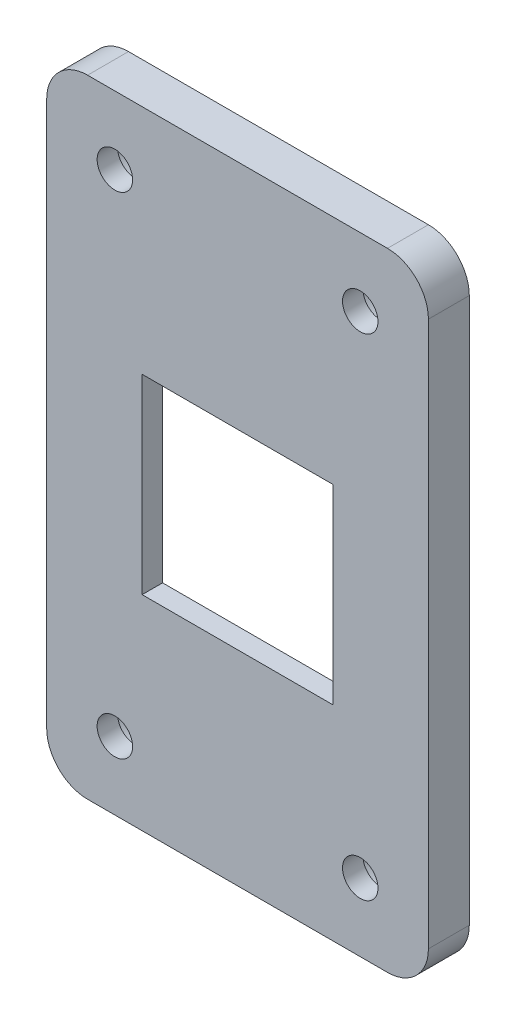
ISO-10303-21;
HEADER;
FILE_DESCRIPTION(('STEP AP214'),'2;1');
FILE_NAME('part.step','',(''),(''),'','','');
FILE_SCHEMA(('AUTOMOTIVE_DESIGN { 1 0 10303 214 1 1 1 1 }'));
ENDSEC;
DATA;
#1=APPLICATION_CONTEXT('core data for automotive mechanical design processes');
#2=APPLICATION_PROTOCOL_DEFINITION('international standard','automotive_design',2000,#1);
#3=PRODUCT_CONTEXT('',#1,'mechanical');
#4=PRODUCT('Part','Part','',(#3));
#5=PRODUCT_RELATED_PRODUCT_CATEGORY('part','',(#4));
#6=PRODUCT_DEFINITION_FORMATION('','',#4);
#7=PRODUCT_DEFINITION_CONTEXT('part definition',#1,'design');
#8=PRODUCT_DEFINITION('design','',#6,#7);
#9=PRODUCT_DEFINITION_SHAPE('','',#8);
#10=(LENGTH_UNIT() NAMED_UNIT(*) SI_UNIT(.MILLI.,.METRE.));
#11=(NAMED_UNIT(*) PLANE_ANGLE_UNIT() SI_UNIT($,.RADIAN.));
#12=(NAMED_UNIT(*) SI_UNIT($,.STERADIAN.) SOLID_ANGLE_UNIT());
#13=UNCERTAINTY_MEASURE_WITH_UNIT(LENGTH_MEASURE(1.E-05),#10,'distance_accuracy_value','');
#14=(GEOMETRIC_REPRESENTATION_CONTEXT(3) GLOBAL_UNCERTAINTY_ASSIGNED_CONTEXT((#13)) GLOBAL_UNIT_ASSIGNED_CONTEXT((#10,
#11,#12)) REPRESENTATION_CONTEXT('',''));
#15=CARTESIAN_POINT('',(0.,0.,0.));
#16=DIRECTION('',(0.,0.,1.));
#17=DIRECTION('',(1.,0.,0.));
#18=AXIS2_PLACEMENT_3D('',#15,#16,#17);
#19=CARTESIAN_POINT('',(-7.,0.,3.));
#20=DIRECTION('',(-1.,0.,0.));
#21=DIRECTION('',(0.,0.,1.));
#22=AXIS2_PLACEMENT_3D('',#19,#20,#21);
#23=PLANE('',#22);
#24=DIRECTION('',(0.,0.,-1.));
#25=VECTOR('',#24,1.);
#26=CARTESIAN_POINT('',(-7.,-8.,3.));
#27=LINE('',#26,#25);
#28=CARTESIAN_POINT('',(-7.,-8.,3.));
#29=VERTEX_POINT('',#28);
#30=CARTESIAN_POINT('',(-7.,-8.,1.5));
#31=VERTEX_POINT('',#30);
#32=EDGE_CURVE('E373',#29,#31,#27,.T.);
#33=ORIENTED_EDGE('',*,*,#32,.T.);
#34=DIRECTION('',(0.,1.,0.));
#35=VECTOR('',#34,1.);
#36=CARTESIAN_POINT('',(-7.,0.,1.5));
#37=LINE('',#36,#35);
#38=CARTESIAN_POINT('',(-7.,6.,1.5));
#39=VERTEX_POINT('',#38);
#40=EDGE_CURVE('E321',#31,#39,#37,.T.);
#41=ORIENTED_EDGE('',*,*,#40,.T.);
#42=DIRECTION('',(0.,0.,-1.));
#43=VECTOR('',#42,1.);
#44=CARTESIAN_POINT('',(-7.,6.,3.));
#45=LINE('',#44,#43);
#46=CARTESIAN_POINT('',(-7.,6.,3.));
#47=VERTEX_POINT('',#46);
#48=EDGE_CURVE('E398',#47,#39,#45,.T.);
#49=ORIENTED_EDGE('',*,*,#48,.F.);
#50=DIRECTION('',(0.,1.,0.));
#51=VECTOR('',#50,1.);
#52=CARTESIAN_POINT('',(-7.,0.,3.));
#53=LINE('',#52,#51);
#54=EDGE_CURVE('E358',#29,#47,#53,.T.);
#55=ORIENTED_EDGE('',*,*,#54,.F.);
#56=EDGE_LOOP('',(#33,#41,#49,#55));
#57=FACE_BOUND('',#56,.T.);
#58=ADVANCED_FACE('F46',(#57),#23,.F.);
#59=CARTESIAN_POINT('',(0.,6.,3.));
#60=DIRECTION('',(0.,1.,0.));
#61=DIRECTION('',(-1.,0.,0.));
#62=AXIS2_PLACEMENT_3D('',#59,#60,#61);
#63=PLANE('',#62);
#64=ORIENTED_EDGE('',*,*,#48,.T.);
#65=DIRECTION('',(1.,0.,0.));
#66=VECTOR('',#65,1.);
#67=CARTESIAN_POINT('',(0.,6.,1.5));
#68=LINE('',#67,#66);
#69=CARTESIAN_POINT('',(7.,6.,1.5));
#70=VERTEX_POINT('',#69);
#71=EDGE_CURVE('E316',#39,#70,#68,.T.);
#72=ORIENTED_EDGE('',*,*,#71,.T.);
#73=DIRECTION('',(0.,0.,-1.));
#74=VECTOR('',#73,1.);
#75=CARTESIAN_POINT('',(7.,6.,3.));
#76=LINE('',#75,#74);
#77=CARTESIAN_POINT('',(7.,6.,3.));
#78=VERTEX_POINT('',#77);
#79=EDGE_CURVE('E394',#78,#70,#76,.T.);
#80=ORIENTED_EDGE('',*,*,#79,.F.);
#81=DIRECTION('',(1.,0.,0.));
#82=VECTOR('',#81,1.);
#83=CARTESIAN_POINT('',(0.,6.,3.));
#84=LINE('',#83,#82);
#85=EDGE_CURVE('E362',#47,#78,#84,.T.);
#86=ORIENTED_EDGE('',*,*,#85,.F.);
#87=EDGE_LOOP('',(#64,#72,#80,#86));
#88=FACE_BOUND('',#87,.T.);
#89=ADVANCED_FACE('F510',(#88),#63,.F.);
#90=CARTESIAN_POINT('',(7.,0.,3.));
#91=DIRECTION('',(-1.,0.,0.));
#92=DIRECTION('',(0.,0.,1.));
#93=AXIS2_PLACEMENT_3D('',#90,#91,#92);
#94=PLANE('',#93);
#95=DIRECTION('',(0.,1.,0.));
#96=VECTOR('',#95,1.);
#97=CARTESIAN_POINT('',(7.,0.,1.5));
#98=LINE('',#97,#96);
#99=CARTESIAN_POINT('',(7.,-8.,1.5));
#100=VERTEX_POINT('',#99);
#101=EDGE_CURVE('E313',#100,#70,#98,.T.);
#102=ORIENTED_EDGE('',*,*,#101,.F.);
#103=DIRECTION('',(0.,0.,-1.));
#104=VECTOR('',#103,1.);
#105=CARTESIAN_POINT('',(7.,-8.,3.));
#106=LINE('',#105,#104);
#107=CARTESIAN_POINT('',(7.,-8.,3.));
#108=VERTEX_POINT('',#107);
#109=EDGE_CURVE('E390',#108,#100,#106,.T.);
#110=ORIENTED_EDGE('',*,*,#109,.F.);
#111=DIRECTION('',(0.,1.,0.));
#112=VECTOR('',#111,1.);
#113=CARTESIAN_POINT('',(7.,0.,3.));
#114=LINE('',#113,#112);
#115=EDGE_CURVE('E365',#108,#78,#114,.T.);
#116=ORIENTED_EDGE('',*,*,#115,.T.);
#117=ORIENTED_EDGE('',*,*,#79,.T.);
#118=EDGE_LOOP('',(#102,#110,#116,#117));
#119=FACE_BOUND('',#118,.T.);
#120=ADVANCED_FACE('F516',(#119),#94,.T.);
#121=CARTESIAN_POINT('',(-14.,0.,3.));
#122=DIRECTION('',(1.,0.,0.));
#123=DIRECTION('',(0.,0.,-1.));
#124=AXIS2_PLACEMENT_3D('',#121,#122,#123);
#125=PLANE('',#124);
#126=DIRECTION('',(0.,-1.,0.));
#127=VECTOR('',#126,1.);
#128=CARTESIAN_POINT('',(-14.,0.,0.));
#129=LINE('',#128,#127);
#130=CARTESIAN_POINT('',(-14.,20.,0.));
#131=VERTEX_POINT('',#130);
#132=CARTESIAN_POINT('',(-14.,-20.,0.));
#133=VERTEX_POINT('',#132);
#134=EDGE_CURVE('E341',#131,#133,#129,.T.);
#135=ORIENTED_EDGE('',*,*,#134,.T.);
#136=DIRECTION('',(0.,0.,-1.));
#137=VECTOR('',#136,1.);
#138=CARTESIAN_POINT('',(-14.,-20.,3.));
#139=LINE('',#138,#137);
#140=CARTESIAN_POINT('',(-14.,-20.,3.));
#141=VERTEX_POINT('',#140);
#142=EDGE_CURVE('E11',#133,#141,#139,.F.);
#143=ORIENTED_EDGE('',*,*,#142,.T.);
#144=DIRECTION('',(0.,-1.,0.));
#145=VECTOR('',#144,1.);
#146=CARTESIAN_POINT('',(-14.,0.,3.));
#147=LINE('',#146,#145);
#148=CARTESIAN_POINT('',(-14.,20.,3.));
#149=VERTEX_POINT('',#148);
#150=EDGE_CURVE('E342',#149,#141,#147,.T.);
#151=ORIENTED_EDGE('',*,*,#150,.F.);
#152=DIRECTION('',(0.,0.,-1.));
#153=VECTOR('',#152,1.);
#154=CARTESIAN_POINT('',(-14.,20.,0.));
#155=LINE('',#154,#153);
#156=EDGE_CURVE('E55',#149,#131,#155,.T.);
#157=ORIENTED_EDGE('',*,*,#156,.T.);
#158=EDGE_LOOP('',(#135,#143,#151,#157));
#159=FACE_BOUND('',#158,.T.);
#160=ADVANCED_FACE('F468',(#159),#125,.F.);
#161=CARTESIAN_POINT('',(0.,-23.,3.));
#162=DIRECTION('',(0.,1.,0.));
#163=DIRECTION('',(0.,0.,1.));
#164=AXIS2_PLACEMENT_3D('',#161,#162,#163);
#165=PLANE('',#164);
#166=DIRECTION('',(1.,0.,0.));
#167=VECTOR('',#166,1.);
#168=CARTESIAN_POINT('',(0.,-23.,0.));
#169=LINE('',#168,#167);
#170=CARTESIAN_POINT('',(-11.,-23.,0.));
#171=VERTEX_POINT('',#170);
#172=CARTESIAN_POINT('',(11.,-23.,0.));
#173=VERTEX_POINT('',#172);
#174=EDGE_CURVE('E377',#171,#173,#169,.T.);
#175=ORIENTED_EDGE('',*,*,#174,.T.);
#176=DIRECTION('',(0.,0.,-1.));
#177=VECTOR('',#176,1.);
#178=CARTESIAN_POINT('',(11.,-23.,3.));
#179=LINE('',#178,#177);
#180=CARTESIAN_POINT('',(11.,-23.,3.));
#181=VERTEX_POINT('',#180);
#182=EDGE_CURVE('E70',#173,#181,#179,.F.);
#183=ORIENTED_EDGE('',*,*,#182,.T.);
#184=DIRECTION('',(1.,0.,0.));
#185=VECTOR('',#184,1.);
#186=CARTESIAN_POINT('',(0.,-23.,3.));
#187=LINE('',#186,#185);
#188=CARTESIAN_POINT('',(-11.,-23.,3.));
#189=VERTEX_POINT('',#188);
#190=EDGE_CURVE('E346',#189,#181,#187,.T.);
#191=ORIENTED_EDGE('',*,*,#190,.F.);
#192=DIRECTION('',(0.,0.,-1.));
#193=VECTOR('',#192,1.);
#194=CARTESIAN_POINT('',(-11.,-23.,3.));
#195=LINE('',#194,#193);
#196=EDGE_CURVE('E457',#189,#171,#195,.T.);
#197=ORIENTED_EDGE('',*,*,#196,.T.);
#198=EDGE_LOOP('',(#175,#183,#191,#197));
#199=FACE_BOUND('',#198,.T.);
#200=ADVANCED_FACE('F480',(#199),#165,.F.);
#201=CARTESIAN_POINT('',(14.,0.,3.));
#202=DIRECTION('',(1.,0.,0.));
#203=DIRECTION('',(0.,0.,-1.));
#204=AXIS2_PLACEMENT_3D('',#201,#202,#203);
#205=PLANE('',#204);
#206=DIRECTION('',(0.,-1.,0.));
#207=VECTOR('',#206,1.);
#208=CARTESIAN_POINT('',(14.,0.,0.));
#209=LINE('',#208,#207);
#210=CARTESIAN_POINT('',(14.,20.,0.));
#211=VERTEX_POINT('',#210);
#212=CARTESIAN_POINT('',(14.,-20.,0.));
#213=VERTEX_POINT('',#212);
#214=EDGE_CURVE('E380',#211,#213,#209,.T.);
#215=ORIENTED_EDGE('',*,*,#214,.F.);
#216=DIRECTION('',(0.,0.,-1.));
#217=VECTOR('',#216,1.);
#218=CARTESIAN_POINT('',(14.,20.,3.));
#219=LINE('',#218,#217);
#220=CARTESIAN_POINT('',(14.,20.,3.));
#221=VERTEX_POINT('',#220);
#222=EDGE_CURVE('E442',#211,#221,#219,.F.);
#223=ORIENTED_EDGE('',*,*,#222,.T.);
#224=DIRECTION('',(0.,-1.,0.));
#225=VECTOR('',#224,1.);
#226=CARTESIAN_POINT('',(14.,0.,3.));
#227=LINE('',#226,#225);
#228=CARTESIAN_POINT('',(14.,-20.,3.));
#229=VERTEX_POINT('',#228);
#230=EDGE_CURVE('E350',#221,#229,#227,.T.);
#231=ORIENTED_EDGE('',*,*,#230,.T.);
#232=DIRECTION('',(0.,0.,-1.));
#233=VECTOR('',#232,1.);
#234=CARTESIAN_POINT('',(14.,-20.,0.));
#235=LINE('',#234,#233);
#236=EDGE_CURVE('E438',#229,#213,#235,.T.);
#237=ORIENTED_EDGE('',*,*,#236,.T.);
#238=EDGE_LOOP('',(#215,#223,#231,#237));
#239=FACE_BOUND('',#238,.T.);
#240=ADVANCED_FACE('F491',(#239),#205,.T.);
#241=CARTESIAN_POINT('',(0.,23.,3.));
#242=DIRECTION('',(0.,1.,0.));
#243=DIRECTION('',(0.,0.,1.));
#244=AXIS2_PLACEMENT_3D('',#241,#242,#243);
#245=PLANE('',#244);
#246=DIRECTION('',(1.,0.,0.));
#247=VECTOR('',#246,1.);
#248=CARTESIAN_POINT('',(0.,23.,3.));
#249=LINE('',#248,#247);
#250=CARTESIAN_POINT('',(-11.,23.,3.));
#251=VERTEX_POINT('',#250);
#252=CARTESIAN_POINT('',(11.,23.,3.));
#253=VERTEX_POINT('',#252);
#254=EDGE_CURVE('E354',#251,#253,#249,.T.);
#255=ORIENTED_EDGE('',*,*,#254,.T.);
#256=DIRECTION('',(0.,0.,-1.));
#257=VECTOR('',#256,1.);
#258=CARTESIAN_POINT('',(11.,23.,3.));
#259=LINE('',#258,#257);
#260=CARTESIAN_POINT('',(11.,23.,0.));
#261=VERTEX_POINT('',#260);
#262=EDGE_CURVE('E422',#253,#261,#259,.T.);
#263=ORIENTED_EDGE('',*,*,#262,.T.);
#264=DIRECTION('',(1.,0.,0.));
#265=VECTOR('',#264,1.);
#266=CARTESIAN_POINT('',(0.,23.,0.));
#267=LINE('',#266,#265);
#268=CARTESIAN_POINT('',(-11.,23.,0.));
#269=VERTEX_POINT('',#268);
#270=EDGE_CURVE('E347',#269,#261,#267,.T.);
#271=ORIENTED_EDGE('',*,*,#270,.F.);
#272=DIRECTION('',(0.,0.,-1.));
#273=VECTOR('',#272,1.);
#274=CARTESIAN_POINT('',(-11.,23.,3.));
#275=LINE('',#274,#273);
#276=EDGE_CURVE('E419',#269,#251,#275,.F.);
#277=ORIENTED_EDGE('',*,*,#276,.T.);
#278=EDGE_LOOP('',(#255,#263,#271,#277));
#279=FACE_BOUND('',#278,.T.);
#280=ADVANCED_FACE('F498',(#279),#245,.T.);
#281=CARTESIAN_POINT('',(0.,-8.,3.));
#282=DIRECTION('',(0.,1.,0.));
#283=DIRECTION('',(-1.,0.,0.));
#284=AXIS2_PLACEMENT_3D('',#281,#282,#283);
#285=PLANE('',#284);
#286=DIRECTION('',(1.,0.,0.));
#287=VECTOR('',#286,1.);
#288=CARTESIAN_POINT('',(0.,-8.,1.5));
#289=LINE('',#288,#287);
#290=EDGE_CURVE('E402',#31,#100,#289,.T.);
#291=ORIENTED_EDGE('',*,*,#290,.F.);
#292=ORIENTED_EDGE('',*,*,#32,.F.);
#293=DIRECTION('',(1.,0.,0.));
#294=VECTOR('',#293,1.);
#295=CARTESIAN_POINT('',(0.,-8.,3.));
#296=LINE('',#295,#294);
#297=EDGE_CURVE('E369',#29,#108,#296,.T.);
#298=ORIENTED_EDGE('',*,*,#297,.T.);
#299=ORIENTED_EDGE('',*,*,#109,.T.);
#300=EDGE_LOOP('',(#291,#292,#298,#299));
#301=FACE_BOUND('',#300,.T.);
#302=ADVANCED_FACE('F523',(#301),#285,.T.);
#303=CARTESIAN_POINT('',(0.,0.,3.));
#304=DIRECTION('',(0.,0.,1.));
#305=DIRECTION('',(1.,0.,0.));
#306=AXIS2_PLACEMENT_3D('',#303,#304,#305);
#307=PLANE('',#306);
#308=CARTESIAN_POINT('',(9.00000000000001,-18.,3.));
#309=DIRECTION('',(0.,0.,-1.));
#310=DIRECTION('',(-1.,0.,0.));
#311=AXIS2_PLACEMENT_3D('',#308,#309,#310);
#312=CIRCLE('',#311,1.3);
#313=CARTESIAN_POINT('',(7.70000000000001,-18.,3.));
#314=VERTEX_POINT('',#313);
#315=EDGE_CURVE('E325',#314,#314,#312,.T.);
#316=ORIENTED_EDGE('',*,*,#315,.T.);
#317=EDGE_LOOP('',(#316));
#318=FACE_BOUND('',#317,.T.);
#319=CARTESIAN_POINT('',(-9.,-18.,3.));
#320=DIRECTION('',(0.,0.,-1.));
#321=DIRECTION('',(-1.,0.,0.));
#322=AXIS2_PLACEMENT_3D('',#319,#320,#321);
#323=CIRCLE('',#322,1.3);
#324=CARTESIAN_POINT('',(-10.3,-18.,3.));
#325=VERTEX_POINT('',#324);
#326=EDGE_CURVE('E329',#325,#325,#323,.T.);
#327=ORIENTED_EDGE('',*,*,#326,.T.);
#328=EDGE_LOOP('',(#327));
#329=FACE_BOUND('',#328,.T.);
#330=CARTESIAN_POINT('',(9.,18.,3.));
#331=DIRECTION('',(0.,0.,-1.));
#332=DIRECTION('',(-1.,0.,0.));
#333=AXIS2_PLACEMENT_3D('',#330,#331,#332);
#334=CIRCLE('',#333,1.3);
#335=CARTESIAN_POINT('',(7.7,18.,3.));
#336=VERTEX_POINT('',#335);
#337=EDGE_CURVE('E333',#336,#336,#334,.T.);
#338=ORIENTED_EDGE('',*,*,#337,.T.);
#339=EDGE_LOOP('',(#338));
#340=FACE_BOUND('',#339,.T.);
#341=CARTESIAN_POINT('',(-9.,18.,3.));
#342=DIRECTION('',(0.,0.,-1.));
#343=DIRECTION('',(-1.,0.,0.));
#344=AXIS2_PLACEMENT_3D('',#341,#342,#343);
#345=CIRCLE('',#344,1.3);
#346=CARTESIAN_POINT('',(-10.3,18.,3.));
#347=VERTEX_POINT('',#346);
#348=EDGE_CURVE('E337',#347,#347,#345,.T.);
#349=ORIENTED_EDGE('',*,*,#348,.T.);
#350=EDGE_LOOP('',(#349));
#351=FACE_BOUND('',#350,.T.);
#352=ORIENTED_EDGE('',*,*,#230,.F.);
#353=CARTESIAN_POINT('',(11.,20.,3.));
#354=DIRECTION('',(0.,0.,1.));
#355=DIRECTION('',(1.,0.,0.));
#356=AXIS2_PLACEMENT_3D('',#353,#354,#355);
#357=CIRCLE('',#356,3.);
#358=EDGE_CURVE('E454',#221,#253,#357,.T.);
#359=ORIENTED_EDGE('',*,*,#358,.T.);
#360=ORIENTED_EDGE('',*,*,#254,.F.);
#361=CARTESIAN_POINT('',(-11.,20.,3.));
#362=DIRECTION('',(0.,0.,1.));
#363=DIRECTION('',(1.,0.,0.));
#364=AXIS2_PLACEMENT_3D('',#361,#362,#363);
#365=CIRCLE('',#364,3.);
#366=EDGE_CURVE('E445',#251,#149,#365,.T.);
#367=ORIENTED_EDGE('',*,*,#366,.T.);
#368=ORIENTED_EDGE('',*,*,#150,.T.);
#369=CARTESIAN_POINT('',(-11.,-20.,3.));
#370=DIRECTION('',(0.,0.,1.));
#371=DIRECTION('',(1.,0.,0.));
#372=AXIS2_PLACEMENT_3D('',#369,#370,#371);
#373=CIRCLE('',#372,3.);
#374=EDGE_CURVE('E448',#141,#189,#373,.T.);
#375=ORIENTED_EDGE('',*,*,#374,.T.);
#376=ORIENTED_EDGE('',*,*,#190,.T.);
#377=CARTESIAN_POINT('',(11.,-20.,3.));
#378=DIRECTION('',(0.,0.,1.));
#379=DIRECTION('',(1.,0.,0.));
#380=AXIS2_PLACEMENT_3D('',#377,#378,#379);
#381=CIRCLE('',#380,3.);
#382=EDGE_CURVE('E451',#181,#229,#381,.T.);
#383=ORIENTED_EDGE('',*,*,#382,.T.);
#384=EDGE_LOOP('',(#352,#359,#360,#367,#368,#375,#376,#383));
#385=FACE_BOUND('',#384,.T.);
#386=ORIENTED_EDGE('',*,*,#54,.T.);
#387=ORIENTED_EDGE('',*,*,#85,.T.);
#388=ORIENTED_EDGE('',*,*,#115,.F.);
#389=ORIENTED_EDGE('',*,*,#297,.F.);
#390=EDGE_LOOP('',(#386,#387,#388,#389));
#391=FACE_BOUND('',#390,.T.);
#392=ADVANCED_FACE('F484',(#318,#329,#340,#351,#385,#391),#307,.T.);
#393=CARTESIAN_POINT('',(0.,0.,0.));
#394=DIRECTION('',(0.,0.,1.));
#395=DIRECTION('',(1.,0.,0.));
#396=AXIS2_PLACEMENT_3D('',#393,#394,#395);
#397=PLANE('',#396);
#398=DIRECTION('',(0.,1.,0.));
#399=VECTOR('',#398,1.);
#400=CARTESIAN_POINT('',(-0.500000000000001,-15.,0.));
#401=LINE('',#400,#399);
#402=CARTESIAN_POINT('',(-0.500000000000001,-15.,0.));
#403=VERTEX_POINT('',#402);
#404=CARTESIAN_POINT('',(-0.5,-13.,0.));
#405=VERTEX_POINT('',#404);
#406=EDGE_CURVE('E221',#403,#405,#401,.T.);
#407=ORIENTED_EDGE('',*,*,#406,.F.);
#408=CARTESIAN_POINT('',(0.,-15.,0.));
#409=DIRECTION('',(0.,0.,-1.));
#410=DIRECTION('',(-1.,0.,0.));
#411=AXIS2_PLACEMENT_3D('',#408,#409,#410);
#412=CIRCLE('',#411,0.5);
#413=CARTESIAN_POINT('',(0.5,-15.,0.));
#414=VERTEX_POINT('',#413);
#415=EDGE_CURVE('E62',#414,#403,#412,.T.);
#416=ORIENTED_EDGE('',*,*,#415,.F.);
#417=DIRECTION('',(0.,-1.,0.));
#418=VECTOR('',#417,1.);
#419=CARTESIAN_POINT('',(0.5,-15.,0.));
#420=LINE('',#419,#418);
#421=CARTESIAN_POINT('',(0.5,-13.,0.));
#422=VERTEX_POINT('',#421);
#423=EDGE_CURVE('E208',#422,#414,#420,.T.);
#424=ORIENTED_EDGE('',*,*,#423,.F.);
#425=CARTESIAN_POINT('',(0.,-13.,0.));
#426=DIRECTION('',(0.,0.,-1.));
#427=DIRECTION('',(-1.,0.,0.));
#428=AXIS2_PLACEMENT_3D('',#425,#426,#427);
#429=CIRCLE('',#428,0.5);
#430=EDGE_CURVE('E212',#405,#422,#429,.T.);
#431=ORIENTED_EDGE('',*,*,#430,.F.);
#432=EDGE_LOOP('',(#407,#416,#424,#431));
#433=FACE_BOUND('',#432,.T.);
#434=CARTESIAN_POINT('',(-9.,-18.,0.));
#435=DIRECTION('',(0.,0.,1.));
#436=DIRECTION('',(1.,0.,0.));
#437=AXIS2_PLACEMENT_3D('',#434,#435,#436);
#438=CIRCLE('',#437,2.5);
#439=CARTESIAN_POINT('',(-6.5,-18.,0.));
#440=VERTEX_POINT('',#439);
#441=EDGE_CURVE('E289',#440,#440,#438,.T.);
#442=ORIENTED_EDGE('',*,*,#441,.T.);
#443=EDGE_LOOP('',(#442));
#444=FACE_BOUND('',#443,.T.);
#445=CARTESIAN_POINT('',(-9.,18.,0.));
#446=DIRECTION('',(0.,0.,1.));
#447=DIRECTION('',(1.,0.,0.));
#448=AXIS2_PLACEMENT_3D('',#445,#446,#447);
#449=CIRCLE('',#448,2.5);
#450=CARTESIAN_POINT('',(-6.5,18.,0.));
#451=VERTEX_POINT('',#450);
#452=EDGE_CURVE('E298',#451,#451,#449,.T.);
#453=ORIENTED_EDGE('',*,*,#452,.T.);
#454=EDGE_LOOP('',(#453));
#455=FACE_BOUND('',#454,.T.);
#456=CARTESIAN_POINT('',(9.,18.,0.));
#457=DIRECTION('',(0.,0.,1.));
#458=DIRECTION('',(1.,0.,0.));
#459=AXIS2_PLACEMENT_3D('',#456,#457,#458);
#460=CIRCLE('',#459,2.5);
#461=CARTESIAN_POINT('',(11.5,18.,0.));
#462=VERTEX_POINT('',#461);
#463=EDGE_CURVE('E236',#462,#462,#460,.T.);
#464=ORIENTED_EDGE('',*,*,#463,.T.);
#465=EDGE_LOOP('',(#464));
#466=FACE_BOUND('',#465,.T.);
#467=DIRECTION('',(1.,0.,0.));
#468=VECTOR('',#467,1.);
#469=CARTESIAN_POINT('',(-10.,-11.,0.));
#470=LINE('',#469,#468);
#471=CARTESIAN_POINT('',(-10.,-11.,0.));
#472=VERTEX_POINT('',#471);
#473=CARTESIAN_POINT('',(10.,-11.,0.));
#474=VERTEX_POINT('',#473);
#475=EDGE_CURVE('E245',#472,#474,#470,.T.);
#476=ORIENTED_EDGE('',*,*,#475,.T.);
#477=DIRECTION('',(0.,1.,0.));
#478=VECTOR('',#477,1.);
#479=CARTESIAN_POINT('',(10.,-11.,0.));
#480=LINE('',#479,#478);
#481=CARTESIAN_POINT('',(10.,9.,0.));
#482=VERTEX_POINT('',#481);
#483=EDGE_CURVE('E269',#474,#482,#480,.T.);
#484=ORIENTED_EDGE('',*,*,#483,.T.);
#485=DIRECTION('',(1.,0.,0.));
#486=VECTOR('',#485,1.);
#487=CARTESIAN_POINT('',(-10.,9.,0.));
#488=LINE('',#487,#486);
#489=CARTESIAN_POINT('',(-10.,9.,0.));
#490=VERTEX_POINT('',#489);
#491=EDGE_CURVE('E264',#490,#482,#488,.T.);
#492=ORIENTED_EDGE('',*,*,#491,.F.);
#493=DIRECTION('',(0.,1.,0.));
#494=VECTOR('',#493,1.);
#495=CARTESIAN_POINT('',(-10.,-11.,0.));
#496=LINE('',#495,#494);
#497=EDGE_CURVE('E260',#472,#490,#496,.T.);
#498=ORIENTED_EDGE('',*,*,#497,.F.);
#499=EDGE_LOOP('',(#476,#484,#492,#498));
#500=FACE_BOUND('',#499,.T.);
#501=CARTESIAN_POINT('',(9.00000000000001,-18.,0.));
#502=DIRECTION('',(0.,0.,1.));
#503=DIRECTION('',(1.,0.,0.));
#504=AXIS2_PLACEMENT_3D('',#501,#502,#503);
#505=CIRCLE('',#504,2.5);
#506=CARTESIAN_POINT('',(11.5,-18.,0.));
#507=VERTEX_POINT('',#506);
#508=EDGE_CURVE('E293',#507,#507,#505,.T.);
#509=ORIENTED_EDGE('',*,*,#508,.T.);
#510=EDGE_LOOP('',(#509));
#511=FACE_BOUND('',#510,.T.);
#512=ORIENTED_EDGE('',*,*,#270,.T.);
#513=CARTESIAN_POINT('',(11.,20.,0.));
#514=DIRECTION('',(0.,0.,1.));
#515=DIRECTION('',(1.,0.,0.));
#516=AXIS2_PLACEMENT_3D('',#513,#514,#515);
#517=CIRCLE('',#516,3.);
#518=EDGE_CURVE('E435',#261,#211,#517,.F.);
#519=ORIENTED_EDGE('',*,*,#518,.T.);
#520=ORIENTED_EDGE('',*,*,#214,.T.);
#521=CARTESIAN_POINT('',(11.,-20.,0.));
#522=DIRECTION('',(0.,0.,1.));
#523=DIRECTION('',(1.,0.,0.));
#524=AXIS2_PLACEMENT_3D('',#521,#522,#523);
#525=CIRCLE('',#524,3.);
#526=EDGE_CURVE('E432',#213,#173,#525,.F.);
#527=ORIENTED_EDGE('',*,*,#526,.T.);
#528=ORIENTED_EDGE('',*,*,#174,.F.);
#529=CARTESIAN_POINT('',(-11.,-20.,0.));
#530=DIRECTION('',(0.,0.,1.));
#531=DIRECTION('',(1.,0.,0.));
#532=AXIS2_PLACEMENT_3D('',#529,#530,#531);
#533=CIRCLE('',#532,3.);
#534=EDGE_CURVE('E429',#171,#133,#533,.F.);
#535=ORIENTED_EDGE('',*,*,#534,.T.);
#536=ORIENTED_EDGE('',*,*,#134,.F.);
#537=CARTESIAN_POINT('',(-11.,20.,0.));
#538=DIRECTION('',(0.,0.,1.));
#539=DIRECTION('',(1.,0.,0.));
#540=AXIS2_PLACEMENT_3D('',#537,#538,#539);
#541=CIRCLE('',#540,3.);
#542=EDGE_CURVE('E426',#131,#269,#541,.F.);
#543=ORIENTED_EDGE('',*,*,#542,.T.);
#544=EDGE_LOOP('',(#512,#519,#520,#527,#528,#535,#536,#543));
#545=FACE_BOUND('',#544,.T.);
#546=ADVANCED_FACE('F473',(#433,#444,#455,#466,#500,#511,#545),#397,.F.);
#547=CARTESIAN_POINT('',(-9.,18.,0.));
#548=DIRECTION('',(0.,0.,-1.));
#549=DIRECTION('',(-1.,0.,0.));
#550=AXIS2_PLACEMENT_3D('',#547,#548,#549);
#551=CYLINDRICAL_SURFACE('',#550,1.3);
#552=CARTESIAN_POINT('',(-9.,18.,1.5));
#553=DIRECTION('',(0.,0.,1.));
#554=DIRECTION('',(1.,0.,0.));
#555=AXIS2_PLACEMENT_3D('',#552,#553,#554);
#556=CIRCLE('',#555,1.3);
#557=CARTESIAN_POINT('',(-7.7,18.,1.5));
#558=VERTEX_POINT('',#557);
#559=EDGE_CURVE('E317',#558,#558,#556,.F.);
#560=ORIENTED_EDGE('',*,*,#559,.T.);
#561=EDGE_LOOP('',(#560));
#562=FACE_BOUND('',#561,.T.);
#563=ORIENTED_EDGE('',*,*,#348,.F.);
#564=EDGE_LOOP('',(#563));
#565=FACE_BOUND('',#564,.T.);
#566=ADVANCED_FACE('F656',(#562,#565),#551,.F.);
#567=CARTESIAN_POINT('',(9.,18.,0.));
#568=DIRECTION('',(0.,0.,-1.));
#569=DIRECTION('',(-1.,0.,0.));
#570=AXIS2_PLACEMENT_3D('',#567,#568,#569);
#571=CYLINDRICAL_SURFACE('',#570,1.3);
#572=CARTESIAN_POINT('',(9.,18.,1.5));
#573=DIRECTION('',(0.,0.,1.));
#574=DIRECTION('',(1.,0.,0.));
#575=AXIS2_PLACEMENT_3D('',#572,#573,#574);
#576=CIRCLE('',#575,1.3);
#577=CARTESIAN_POINT('',(10.3,18.,1.5));
#578=VERTEX_POINT('',#577);
#579=EDGE_CURVE('E410',#578,#578,#576,.F.);
#580=ORIENTED_EDGE('',*,*,#579,.T.);
#581=EDGE_LOOP('',(#580));
#582=FACE_BOUND('',#581,.T.);
#583=ORIENTED_EDGE('',*,*,#337,.F.);
#584=EDGE_LOOP('',(#583));
#585=FACE_BOUND('',#584,.T.);
#586=ADVANCED_FACE('F652',(#582,#585),#571,.F.);
#587=CARTESIAN_POINT('',(-9.,-18.,0.));
#588=DIRECTION('',(0.,0.,-1.));
#589=DIRECTION('',(-1.,0.,0.));
#590=AXIS2_PLACEMENT_3D('',#587,#588,#589);
#591=CYLINDRICAL_SURFACE('',#590,1.3);
#592=CARTESIAN_POINT('',(-9.,-18.,1.5));
#593=DIRECTION('',(0.,0.,1.));
#594=DIRECTION('',(1.,0.,0.));
#595=AXIS2_PLACEMENT_3D('',#592,#593,#594);
#596=CIRCLE('',#595,1.3);
#597=CARTESIAN_POINT('',(-7.7,-18.,1.5));
#598=VERTEX_POINT('',#597);
#599=EDGE_CURVE('E406',#598,#598,#596,.F.);
#600=ORIENTED_EDGE('',*,*,#599,.T.);
#601=EDGE_LOOP('',(#600));
#602=FACE_BOUND('',#601,.T.);
#603=ORIENTED_EDGE('',*,*,#326,.F.);
#604=EDGE_LOOP('',(#603));
#605=FACE_BOUND('',#604,.T.);
#606=ADVANCED_FACE('F648',(#602,#605),#591,.F.);
#607=CARTESIAN_POINT('',(9.00000000000001,-18.,0.));
#608=DIRECTION('',(0.,0.,-1.));
#609=DIRECTION('',(-1.,0.,0.));
#610=AXIS2_PLACEMENT_3D('',#607,#608,#609);
#611=CYLINDRICAL_SURFACE('',#610,1.3);
#612=CARTESIAN_POINT('',(9.00000000000001,-18.,1.5));
#613=DIRECTION('',(0.,0.,1.));
#614=DIRECTION('',(1.,0.,0.));
#615=AXIS2_PLACEMENT_3D('',#612,#613,#614);
#616=CIRCLE('',#615,1.3);
#617=CARTESIAN_POINT('',(10.3,-18.,1.5));
#618=VERTEX_POINT('',#617);
#619=EDGE_CURVE('E309',#618,#618,#616,.F.);
#620=ORIENTED_EDGE('',*,*,#619,.T.);
#621=EDGE_LOOP('',(#620));
#622=FACE_BOUND('',#621,.T.);
#623=ORIENTED_EDGE('',*,*,#315,.F.);
#624=EDGE_LOOP('',(#623));
#625=FACE_BOUND('',#624,.T.);
#626=ADVANCED_FACE('F641',(#622,#625),#611,.F.);
#627=CARTESIAN_POINT('',(0.,0.,1.5));
#628=DIRECTION('',(0.,0.,1.));
#629=DIRECTION('',(1.,0.,0.));
#630=AXIS2_PLACEMENT_3D('',#627,#628,#629);
#631=PLANE('',#630);
#632=CARTESIAN_POINT('',(9.00000000000001,-18.,1.5));
#633=DIRECTION('',(0.,0.,1.));
#634=DIRECTION('',(1.,0.,0.));
#635=AXIS2_PLACEMENT_3D('',#632,#633,#634);
#636=CIRCLE('',#635,2.5);
#637=CARTESIAN_POINT('',(11.5,-18.,1.5));
#638=VERTEX_POINT('',#637);
#639=EDGE_CURVE('E305',#638,#638,#636,.T.);
#640=ORIENTED_EDGE('',*,*,#639,.F.);
#641=EDGE_LOOP('',(#640));
#642=FACE_BOUND('',#641,.T.);
#643=ORIENTED_EDGE('',*,*,#619,.F.);
#644=EDGE_LOOP('',(#643));
#645=FACE_BOUND('',#644,.T.);
#646=ADVANCED_FACE('F638',(#642,#645),#631,.F.);
#647=CARTESIAN_POINT('',(9.00000000000001,-18.,1.5));
#648=DIRECTION('',(0.,0.,-1.));
#649=DIRECTION('',(-1.,0.,0.));
#650=AXIS2_PLACEMENT_3D('',#647,#648,#649);
#651=CYLINDRICAL_SURFACE('',#650,2.5);
#652=ORIENTED_EDGE('',*,*,#639,.T.);
#653=EDGE_LOOP('',(#652));
#654=FACE_BOUND('',#653,.T.);
#655=ORIENTED_EDGE('',*,*,#508,.F.);
#656=EDGE_LOOP('',(#655));
#657=FACE_BOUND('',#656,.T.);
#658=ADVANCED_FACE('F630',(#654,#657),#651,.F.);
#659=CARTESIAN_POINT('',(0.,0.,1.5));
#660=DIRECTION('',(0.,0.,1.));
#661=DIRECTION('',(1.,0.,0.));
#662=AXIS2_PLACEMENT_3D('',#659,#660,#661);
#663=PLANE('',#662);
#664=CARTESIAN_POINT('',(-9.,-18.,1.5));
#665=DIRECTION('',(0.,0.,1.));
#666=DIRECTION('',(1.,0.,0.));
#667=AXIS2_PLACEMENT_3D('',#664,#665,#666);
#668=CIRCLE('',#667,2.5);
#669=CARTESIAN_POINT('',(-6.5,-18.,1.5));
#670=VERTEX_POINT('',#669);
#671=EDGE_CURVE('E294',#670,#670,#668,.T.);
#672=ORIENTED_EDGE('',*,*,#671,.F.);
#673=EDGE_LOOP('',(#672));
#674=FACE_BOUND('',#673,.T.);
#675=ORIENTED_EDGE('',*,*,#599,.F.);
#676=EDGE_LOOP('',(#675));
#677=FACE_BOUND('',#676,.T.);
#678=ADVANCED_FACE('F626',(#674,#677),#663,.F.);
#679=CARTESIAN_POINT('',(-9.,-18.,1.5));
#680=DIRECTION('',(0.,0.,-1.));
#681=DIRECTION('',(-1.,0.,0.));
#682=AXIS2_PLACEMENT_3D('',#679,#680,#681);
#683=CYLINDRICAL_SURFACE('',#682,2.5);
#684=ORIENTED_EDGE('',*,*,#671,.T.);
#685=EDGE_LOOP('',(#684));
#686=FACE_BOUND('',#685,.T.);
#687=ORIENTED_EDGE('',*,*,#441,.F.);
#688=EDGE_LOOP('',(#687));
#689=FACE_BOUND('',#688,.T.);
#690=ADVANCED_FACE('F602',(#686,#689),#683,.F.);
#691=CARTESIAN_POINT('',(0.,0.,1.5));
#692=DIRECTION('',(0.,0.,1.));
#693=DIRECTION('',(1.,0.,0.));
#694=AXIS2_PLACEMENT_3D('',#691,#692,#693);
#695=PLANE('',#694);
#696=CARTESIAN_POINT('',(9.,18.,1.5));
#697=DIRECTION('',(0.,0.,1.));
#698=DIRECTION('',(1.,0.,0.));
#699=AXIS2_PLACEMENT_3D('',#696,#697,#698);
#700=CIRCLE('',#699,2.5);
#701=CARTESIAN_POINT('',(11.5,18.,1.5));
#702=VERTEX_POINT('',#701);
#703=EDGE_CURVE('E241',#702,#702,#700,.T.);
#704=ORIENTED_EDGE('',*,*,#703,.F.);
#705=EDGE_LOOP('',(#704));
#706=FACE_BOUND('',#705,.T.);
#707=ORIENTED_EDGE('',*,*,#579,.F.);
#708=EDGE_LOOP('',(#707));
#709=FACE_BOUND('',#708,.T.);
#710=ADVANCED_FACE('F598',(#706,#709),#695,.F.);
#711=CARTESIAN_POINT('',(9.,18.,1.5));
#712=DIRECTION('',(0.,0.,-1.));
#713=DIRECTION('',(-1.,0.,0.));
#714=AXIS2_PLACEMENT_3D('',#711,#712,#713);
#715=CYLINDRICAL_SURFACE('',#714,2.5);
#716=ORIENTED_EDGE('',*,*,#703,.T.);
#717=EDGE_LOOP('',(#716));
#718=FACE_BOUND('',#717,.T.);
#719=ORIENTED_EDGE('',*,*,#463,.F.);
#720=EDGE_LOOP('',(#719));
#721=FACE_BOUND('',#720,.T.);
#722=ADVANCED_FACE('F594',(#718,#721),#715,.F.);
#723=CARTESIAN_POINT('',(0.,0.,1.5));
#724=DIRECTION('',(0.,0.,1.));
#725=DIRECTION('',(1.,0.,0.));
#726=AXIS2_PLACEMENT_3D('',#723,#724,#725);
#727=PLANE('',#726);
#728=CARTESIAN_POINT('',(-9.,18.,1.5));
#729=DIRECTION('',(0.,0.,1.));
#730=DIRECTION('',(1.,0.,0.));
#731=AXIS2_PLACEMENT_3D('',#728,#729,#730);
#732=CIRCLE('',#731,2.5);
#733=CARTESIAN_POINT('',(-6.5,18.,1.5));
#734=VERTEX_POINT('',#733);
#735=EDGE_CURVE('E240',#734,#734,#732,.T.);
#736=ORIENTED_EDGE('',*,*,#735,.F.);
#737=EDGE_LOOP('',(#736));
#738=FACE_BOUND('',#737,.T.);
#739=ORIENTED_EDGE('',*,*,#559,.F.);
#740=EDGE_LOOP('',(#739));
#741=FACE_BOUND('',#740,.T.);
#742=ADVANCED_FACE('F597',(#738,#741),#727,.F.);
#743=CARTESIAN_POINT('',(-9.,18.,1.5));
#744=DIRECTION('',(0.,0.,-1.));
#745=DIRECTION('',(-1.,0.,0.));
#746=AXIS2_PLACEMENT_3D('',#743,#744,#745);
#747=CYLINDRICAL_SURFACE('',#746,2.5);
#748=ORIENTED_EDGE('',*,*,#735,.T.);
#749=EDGE_LOOP('',(#748));
#750=FACE_BOUND('',#749,.T.);
#751=ORIENTED_EDGE('',*,*,#452,.F.);
#752=EDGE_LOOP('',(#751));
#753=FACE_BOUND('',#752,.T.);
#754=ADVANCED_FACE('F622',(#750,#753),#747,.F.);
#755=CARTESIAN_POINT('',(0.,0.,1.5));
#756=DIRECTION('',(0.,0.,1.));
#757=DIRECTION('',(1.,0.,0.));
#758=AXIS2_PLACEMENT_3D('',#755,#756,#757);
#759=PLANE('',#758);
#760=DIRECTION('',(1.,0.,0.));
#761=VECTOR('',#760,1.);
#762=CARTESIAN_POINT('',(-10.,-11.,1.5));
#763=LINE('',#762,#761);
#764=CARTESIAN_POINT('',(-10.,-11.,1.5));
#765=VERTEX_POINT('',#764);
#766=CARTESIAN_POINT('',(10.,-11.,1.5));
#767=VERTEX_POINT('',#766);
#768=EDGE_CURVE('E265',#765,#767,#763,.T.);
#769=ORIENTED_EDGE('',*,*,#768,.F.);
#770=DIRECTION('',(0.,1.,0.));
#771=VECTOR('',#770,1.);
#772=CARTESIAN_POINT('',(-10.,-11.,1.5));
#773=LINE('',#772,#771);
#774=CARTESIAN_POINT('',(-10.,9.,1.5));
#775=VERTEX_POINT('',#774);
#776=EDGE_CURVE('E259',#765,#775,#773,.T.);
#777=ORIENTED_EDGE('',*,*,#776,.T.);
#778=DIRECTION('',(1.,0.,0.));
#779=VECTOR('',#778,1.);
#780=CARTESIAN_POINT('',(-10.,9.,1.5));
#781=LINE('',#780,#779);
#782=CARTESIAN_POINT('',(10.,9.,1.5));
#783=VERTEX_POINT('',#782);
#784=EDGE_CURVE('E279',#775,#783,#781,.T.);
#785=ORIENTED_EDGE('',*,*,#784,.T.);
#786=DIRECTION('',(0.,1.,0.));
#787=VECTOR('',#786,1.);
#788=CARTESIAN_POINT('',(10.,-11.,1.5));
#789=LINE('',#788,#787);
#790=EDGE_CURVE('E283',#767,#783,#789,.T.);
#791=ORIENTED_EDGE('',*,*,#790,.F.);
#792=EDGE_LOOP('',(#769,#777,#785,#791));
#793=FACE_BOUND('',#792,.T.);
#794=ORIENTED_EDGE('',*,*,#290,.T.);
#795=ORIENTED_EDGE('',*,*,#101,.T.);
#796=ORIENTED_EDGE('',*,*,#71,.F.);
#797=ORIENTED_EDGE('',*,*,#40,.F.);
#798=EDGE_LOOP('',(#794,#795,#796,#797));
#799=FACE_BOUND('',#798,.T.);
#800=ADVANCED_FACE('F608',(#793,#799),#759,.F.);
#801=CARTESIAN_POINT('',(-10.,-11.,1.5));
#802=DIRECTION('',(0.,1.,0.));
#803=DIRECTION('',(-1.,0.,0.));
#804=AXIS2_PLACEMENT_3D('',#801,#802,#803);
#805=PLANE('',#804);
#806=ORIENTED_EDGE('',*,*,#475,.F.);
#807=DIRECTION('',(0.,0.,-1.));
#808=VECTOR('',#807,1.);
#809=CARTESIAN_POINT('',(-10.,-11.,1.5));
#810=LINE('',#809,#808);
#811=EDGE_CURVE('E255',#765,#472,#810,.T.);
#812=ORIENTED_EDGE('',*,*,#811,.F.);
#813=ORIENTED_EDGE('',*,*,#768,.T.);
#814=DIRECTION('',(0.,0.,-1.));
#815=VECTOR('',#814,1.);
#816=CARTESIAN_POINT('',(10.,-11.,1.5));
#817=LINE('',#816,#815);
#818=EDGE_CURVE('E230',#767,#474,#817,.T.);
#819=ORIENTED_EDGE('',*,*,#818,.T.);
#820=EDGE_LOOP('',(#806,#812,#813,#819));
#821=FACE_BOUND('',#820,.T.);
#822=ADVANCED_FACE('F604',(#821),#805,.T.);
#823=CARTESIAN_POINT('',(10.,-11.,1.5));
#824=DIRECTION('',(-1.,0.,0.));
#825=DIRECTION('',(0.,-1.,0.));
#826=AXIS2_PLACEMENT_3D('',#823,#824,#825);
#827=PLANE('',#826);
#828=ORIENTED_EDGE('',*,*,#483,.F.);
#829=ORIENTED_EDGE('',*,*,#818,.F.);
#830=ORIENTED_EDGE('',*,*,#790,.T.);
#831=DIRECTION('',(0.,0.,-1.));
#832=VECTOR('',#831,1.);
#833=CARTESIAN_POINT('',(10.,9.,1.5));
#834=LINE('',#833,#832);
#835=EDGE_CURVE('E249',#783,#482,#834,.T.);
#836=ORIENTED_EDGE('',*,*,#835,.T.);
#837=EDGE_LOOP('',(#828,#829,#830,#836));
#838=FACE_BOUND('',#837,.T.);
#839=ADVANCED_FACE('F607',(#838),#827,.T.);
#840=CARTESIAN_POINT('',(-10.,9.,1.5));
#841=DIRECTION('',(0.,1.,0.));
#842=DIRECTION('',(-1.,0.,0.));
#843=AXIS2_PLACEMENT_3D('',#840,#841,#842);
#844=PLANE('',#843);
#845=ORIENTED_EDGE('',*,*,#491,.T.);
#846=ORIENTED_EDGE('',*,*,#835,.F.);
#847=ORIENTED_EDGE('',*,*,#784,.F.);
#848=DIRECTION('',(0.,0.,-1.));
#849=VECTOR('',#848,1.);
#850=CARTESIAN_POINT('',(-10.,9.,1.5));
#851=LINE('',#850,#849);
#852=EDGE_CURVE('E252',#775,#490,#851,.T.);
#853=ORIENTED_EDGE('',*,*,#852,.T.);
#854=EDGE_LOOP('',(#845,#846,#847,#853));
#855=FACE_BOUND('',#854,.T.);
#856=ADVANCED_FACE('F612',(#855),#844,.F.);
#857=CARTESIAN_POINT('',(-10.,-11.,1.5));
#858=DIRECTION('',(-1.,0.,0.));
#859=DIRECTION('',(0.,0.,1.));
#860=AXIS2_PLACEMENT_3D('',#857,#858,#859);
#861=PLANE('',#860);
#862=ORIENTED_EDGE('',*,*,#497,.T.);
#863=ORIENTED_EDGE('',*,*,#852,.F.);
#864=ORIENTED_EDGE('',*,*,#776,.F.);
#865=ORIENTED_EDGE('',*,*,#811,.T.);
#866=EDGE_LOOP('',(#862,#863,#864,#865));
#867=FACE_BOUND('',#866,.T.);
#868=ADVANCED_FACE('F532',(#867),#861,.F.);
#869=CARTESIAN_POINT('',(11.,20.,3.));
#870=DIRECTION('',(0.,0.,-1.));
#871=DIRECTION('',(-1.,0.,0.));
#872=AXIS2_PLACEMENT_3D('',#869,#870,#871);
#873=CYLINDRICAL_SURFACE('',#872,3.);
#874=ORIENTED_EDGE('',*,*,#358,.F.);
#875=ORIENTED_EDGE('',*,*,#222,.F.);
#876=ORIENTED_EDGE('',*,*,#518,.F.);
#877=ORIENTED_EDGE('',*,*,#262,.F.);
#878=EDGE_LOOP('',(#874,#875,#876,#877));
#879=FACE_BOUND('',#878,.T.);
#880=ADVANCED_FACE('F496',(#879),#873,.T.);
#881=CARTESIAN_POINT('',(11.,-20.,3.));
#882=DIRECTION('',(0.,0.,1.));
#883=DIRECTION('',(1.,0.,0.));
#884=AXIS2_PLACEMENT_3D('',#881,#882,#883);
#885=CYLINDRICAL_SURFACE('',#884,3.);
#886=ORIENTED_EDGE('',*,*,#382,.F.);
#887=ORIENTED_EDGE('',*,*,#182,.F.);
#888=ORIENTED_EDGE('',*,*,#526,.F.);
#889=ORIENTED_EDGE('',*,*,#236,.F.);
#890=EDGE_LOOP('',(#886,#887,#888,#889));
#891=FACE_BOUND('',#890,.T.);
#892=ADVANCED_FACE('F488',(#891),#885,.T.);
#893=CARTESIAN_POINT('',(-11.,-20.,3.));
#894=DIRECTION('',(0.,0.,-1.));
#895=DIRECTION('',(-1.,0.,0.));
#896=AXIS2_PLACEMENT_3D('',#893,#894,#895);
#897=CYLINDRICAL_SURFACE('',#896,3.);
#898=ORIENTED_EDGE('',*,*,#374,.F.);
#899=ORIENTED_EDGE('',*,*,#142,.F.);
#900=ORIENTED_EDGE('',*,*,#534,.F.);
#901=ORIENTED_EDGE('',*,*,#196,.F.);
#902=EDGE_LOOP('',(#898,#899,#900,#901));
#903=FACE_BOUND('',#902,.T.);
#904=ADVANCED_FACE('F479',(#903),#897,.T.);
#905=CARTESIAN_POINT('',(-11.,20.,3.));
#906=DIRECTION('',(0.,0.,1.));
#907=DIRECTION('',(1.,0.,0.));
#908=AXIS2_PLACEMENT_3D('',#905,#906,#907);
#909=CYLINDRICAL_SURFACE('',#908,3.);
#910=ORIENTED_EDGE('',*,*,#366,.F.);
#911=ORIENTED_EDGE('',*,*,#276,.F.);
#912=ORIENTED_EDGE('',*,*,#542,.F.);
#913=ORIENTED_EDGE('',*,*,#156,.F.);
#914=EDGE_LOOP('',(#910,#911,#912,#913));
#915=FACE_BOUND('',#914,.T.);
#916=ADVANCED_FACE('F48',(#915),#909,.T.);
#917=CARTESIAN_POINT('',(0.,-15.,0.4));
#918=DIRECTION('',(0.,0.,-1.));
#919=DIRECTION('',(-1.,0.,0.));
#920=AXIS2_PLACEMENT_3D('',#917,#918,#919);
#921=CYLINDRICAL_SURFACE('',#920,0.5);
#922=ORIENTED_EDGE('',*,*,#415,.T.);
#923=DIRECTION('',(0.,0.,-1.));
#924=VECTOR('',#923,1.);
#925=CARTESIAN_POINT('',(-0.500000000000001,-15.,0.4));
#926=LINE('',#925,#924);
#927=CARTESIAN_POINT('',(-0.500000000000001,-15.,0.4));
#928=VERTEX_POINT('',#927);
#929=EDGE_CURVE('E183',#928,#403,#926,.T.);
#930=ORIENTED_EDGE('',*,*,#929,.F.);
#931=CARTESIAN_POINT('',(0.,-15.,0.4));
#932=DIRECTION('',(0.,0.,-1.));
#933=DIRECTION('',(-1.,0.,0.));
#934=AXIS2_PLACEMENT_3D('',#931,#932,#933);
#935=CIRCLE('',#934,0.5);
#936=CARTESIAN_POINT('',(0.5,-15.,0.4));
#937=VERTEX_POINT('',#936);
#938=EDGE_CURVE('E187',#937,#928,#935,.T.);
#939=ORIENTED_EDGE('',*,*,#938,.F.);
#940=DIRECTION('',(0.,0.,-1.));
#941=VECTOR('',#940,1.);
#942=CARTESIAN_POINT('',(0.5,-15.,0.4));
#943=LINE('',#942,#941);
#944=EDGE_CURVE('E227',#937,#414,#943,.T.);
#945=ORIENTED_EDGE('',*,*,#944,.T.);
#946=EDGE_LOOP('',(#922,#930,#939,#945));
#947=FACE_BOUND('',#946,.T.);
#948=ADVANCED_FACE('F185',(#947),#921,.F.);
#949=CARTESIAN_POINT('',(0.5,-15.,0.4));
#950=DIRECTION('',(1.,0.,0.));
#951=DIRECTION('',(0.,1.,0.));
#952=AXIS2_PLACEMENT_3D('',#949,#950,#951);
#953=PLANE('',#952);
#954=ORIENTED_EDGE('',*,*,#423,.T.);
#955=ORIENTED_EDGE('',*,*,#944,.F.);
#956=DIRECTION('',(0.,-1.,0.));
#957=VECTOR('',#956,1.);
#958=CARTESIAN_POINT('',(0.5,-15.,0.4));
#959=LINE('',#958,#957);
#960=CARTESIAN_POINT('',(0.5,-13.,0.4));
#961=VERTEX_POINT('',#960);
#962=EDGE_CURVE('E194',#961,#937,#959,.T.);
#963=ORIENTED_EDGE('',*,*,#962,.F.);
#964=DIRECTION('',(0.,0.,-1.));
#965=VECTOR('',#964,1.);
#966=CARTESIAN_POINT('',(0.5,-13.,0.4));
#967=LINE('',#966,#965);
#968=EDGE_CURVE('E231',#961,#422,#967,.T.);
#969=ORIENTED_EDGE('',*,*,#968,.T.);
#970=EDGE_LOOP('',(#954,#955,#963,#969));
#971=FACE_BOUND('',#970,.T.);
#972=ADVANCED_FACE('F507',(#971),#953,.F.);
#973=CARTESIAN_POINT('',(0.,-13.,0.4));
#974=DIRECTION('',(0.,0.,-1.));
#975=DIRECTION('',(-1.,0.,0.));
#976=AXIS2_PLACEMENT_3D('',#973,#974,#975);
#977=CYLINDRICAL_SURFACE('',#976,0.5);
#978=ORIENTED_EDGE('',*,*,#430,.T.);
#979=ORIENTED_EDGE('',*,*,#968,.F.);
#980=CARTESIAN_POINT('',(0.,-13.,0.4));
#981=DIRECTION('',(0.,0.,-1.));
#982=DIRECTION('',(-1.,0.,0.));
#983=AXIS2_PLACEMENT_3D('',#980,#981,#982);
#984=CIRCLE('',#983,0.5);
#985=CARTESIAN_POINT('',(-0.5,-13.,0.4));
#986=VERTEX_POINT('',#985);
#987=EDGE_CURVE('E203',#986,#961,#984,.T.);
#988=ORIENTED_EDGE('',*,*,#987,.F.);
#989=DIRECTION('',(0.,0.,-1.));
#990=VECTOR('',#989,1.);
#991=CARTESIAN_POINT('',(-0.5,-13.,0.4));
#992=LINE('',#991,#990);
#993=EDGE_CURVE('E193',#986,#405,#992,.T.);
#994=ORIENTED_EDGE('',*,*,#993,.T.);
#995=EDGE_LOOP('',(#978,#979,#988,#994));
#996=FACE_BOUND('',#995,.T.);
#997=ADVANCED_FACE('F564',(#996),#977,.F.);
#998=CARTESIAN_POINT('',(-0.500000000000001,-15.,0.4));
#999=DIRECTION('',(-1.,0.,0.));
#1000=DIRECTION('',(0.,-1.,0.));
#1001=AXIS2_PLACEMENT_3D('',#998,#999,#1000);
#1002=PLANE('',#1001);
#1003=ORIENTED_EDGE('',*,*,#406,.T.);
#1004=ORIENTED_EDGE('',*,*,#993,.F.);
#1005=DIRECTION('',(0.,1.,0.));
#1006=VECTOR('',#1005,1.);
#1007=CARTESIAN_POINT('',(-0.500000000000001,-15.,0.4));
#1008=LINE('',#1007,#1006);
#1009=EDGE_CURVE('E197',#928,#986,#1008,.T.);
#1010=ORIENTED_EDGE('',*,*,#1009,.F.);
#1011=ORIENTED_EDGE('',*,*,#929,.T.);
#1012=EDGE_LOOP('',(#1003,#1004,#1010,#1011));
#1013=FACE_BOUND('',#1012,.T.);
#1014=ADVANCED_FACE('F198',(#1013),#1002,.F.);
#1015=CARTESIAN_POINT('',(0.,-15.,0.4));
#1016=DIRECTION('',(0.,0.,-1.));
#1017=DIRECTION('',(-1.,0.,0.));
#1018=AXIS2_PLACEMENT_3D('',#1015,#1016,#1017);
#1019=PLANE('',#1018);
#1020=ORIENTED_EDGE('',*,*,#938,.T.);
#1021=ORIENTED_EDGE('',*,*,#1009,.T.);
#1022=ORIENTED_EDGE('',*,*,#987,.T.);
#1023=ORIENTED_EDGE('',*,*,#962,.T.);
#1024=EDGE_LOOP('',(#1020,#1021,#1022,#1023));
#1025=FACE_BOUND('',#1024,.T.);
#1026=ADVANCED_FACE('F205',(#1025),#1019,.T.);
#1027=CLOSED_SHELL('',(#58,#89,#120,#160,#200,#240,#280,#302,#392,#546,#566,#586,#606,#626,#646,
#658,#678,#690,#710,#722,#742,#754,#800,#822,#839,#856,#868,#880,#892,#904,#916,#948,#972,#997,
#1014,#1026));
#1028=MANIFOLD_SOLID_BREP('B2',#1027);
#1029=ADVANCED_BREP_SHAPE_REPRESENTATION('',(#18,#1028),#14);
#1030=SHAPE_DEFINITION_REPRESENTATION(#9,#1029);
ENDSEC;
END-ISO-10303-21;
